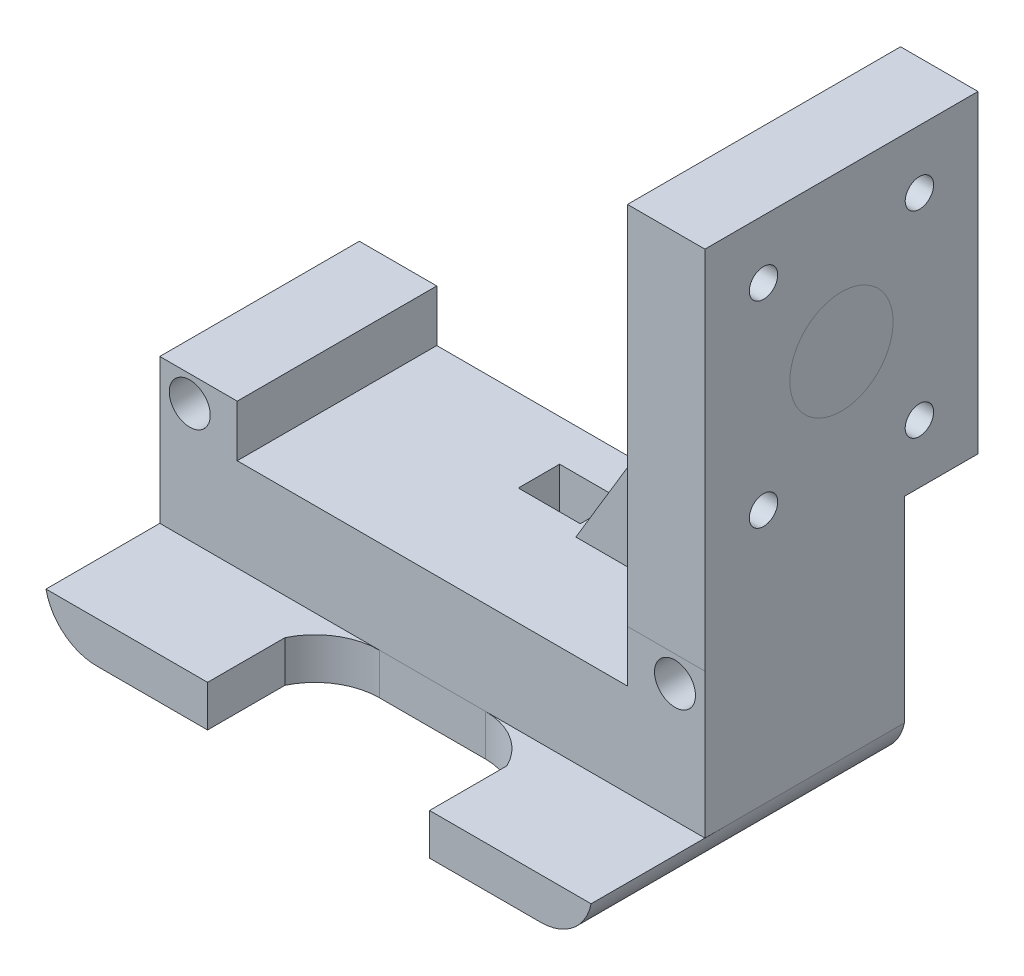
ISO-10303-21;
HEADER;
FILE_DESCRIPTION(('STEP AP214'),'2;1');
FILE_NAME('part.step','',(''),(''),'','','');
FILE_SCHEMA(('AUTOMOTIVE_DESIGN { 1 0 10303 214 1 1 1 1 }'));
ENDSEC;
DATA;
#1=APPLICATION_CONTEXT('core data for automotive mechanical design processes');
#2=APPLICATION_PROTOCOL_DEFINITION('international standard','automotive_design',2000,#1);
#3=PRODUCT_CONTEXT('',#1,'mechanical');
#4=PRODUCT('Part','Part','',(#3));
#5=PRODUCT_RELATED_PRODUCT_CATEGORY('part','',(#4));
#6=PRODUCT_DEFINITION_FORMATION('','',#4);
#7=PRODUCT_DEFINITION_CONTEXT('part definition',#1,'design');
#8=PRODUCT_DEFINITION('design','',#6,#7);
#9=PRODUCT_DEFINITION_SHAPE('','',#8);
#10=(LENGTH_UNIT() NAMED_UNIT(*) SI_UNIT(.MILLI.,.METRE.));
#11=(NAMED_UNIT(*) PLANE_ANGLE_UNIT() SI_UNIT($,.RADIAN.));
#12=(NAMED_UNIT(*) SI_UNIT($,.STERADIAN.) SOLID_ANGLE_UNIT());
#13=UNCERTAINTY_MEASURE_WITH_UNIT(LENGTH_MEASURE(1.E-05),#10,'distance_accuracy_value','');
#14=(GEOMETRIC_REPRESENTATION_CONTEXT(3) GLOBAL_UNCERTAINTY_ASSIGNED_CONTEXT((#13)) GLOBAL_UNIT_ASSIGNED_CONTEXT((#10,
#11,#12)) REPRESENTATION_CONTEXT('',''));
#15=CARTESIAN_POINT('',(0.,0.,0.));
#16=DIRECTION('',(0.,0.,1.));
#17=DIRECTION('',(1.,0.,0.));
#18=AXIS2_PLACEMENT_3D('',#15,#16,#17);
#19=CARTESIAN_POINT('',(52.7979589711327,18.,-35.7));
#20=DIRECTION('',(-1.,0.,0.));
#21=DIRECTION('',(0.,0.,1.));
#22=AXIS2_PLACEMENT_3D('',#19,#20,#21);
#23=PLANE('',#22);
#24=CARTESIAN_POINT('',(52.7979589711327,87.45,-48.5961117147642));
#25=DIRECTION('',(1.,0.,0.));
#26=DIRECTION('',(0.,0.,-1.));
#27=AXIS2_PLACEMENT_3D('',#24,#25,#26);
#28=CIRCLE('',#27,2.74999999999999);
#29=CARTESIAN_POINT('',(52.7979589711327,87.45,-51.3461117147642));
#30=VERTEX_POINT('',#29);
#31=EDGE_CURVE('E559',#30,#30,#28,.T.);
#32=ORIENTED_EDGE('',*,*,#31,.F.);
#33=EDGE_LOOP('',(#32));
#34=FACE_BOUND('',#33,.T.);
#35=CARTESIAN_POINT('',(52.7979589711327,87.45,-18.3961117147642));
#36=DIRECTION('',(1.,0.,0.));
#37=DIRECTION('',(0.,0.,-1.));
#38=AXIS2_PLACEMENT_3D('',#35,#36,#37);
#39=CIRCLE('',#38,2.74999999999999);
#40=CARTESIAN_POINT('',(52.7979589711327,87.45,-21.1461117147642));
#41=VERTEX_POINT('',#40);
#42=EDGE_CURVE('E498',#41,#41,#39,.T.);
#43=ORIENTED_EDGE('',*,*,#42,.F.);
#44=EDGE_LOOP('',(#43));
#45=FACE_BOUND('',#44,.T.);
#46=CARTESIAN_POINT('',(52.7979589711327,49.35,-18.3961117147642));
#47=DIRECTION('',(1.,0.,0.));
#48=DIRECTION('',(0.,0.,-1.));
#49=AXIS2_PLACEMENT_3D('',#46,#47,#48);
#50=CIRCLE('',#49,2.74999999999999);
#51=CARTESIAN_POINT('',(52.7979589711327,49.35,-21.1461117147642));
#52=VERTEX_POINT('',#51);
#53=EDGE_CURVE('E497',#52,#52,#50,.T.);
#54=ORIENTED_EDGE('',*,*,#53,.F.);
#55=EDGE_LOOP('',(#54));
#56=FACE_BOUND('',#55,.T.);
#57=DIRECTION('',(0.,-1.,0.));
#58=VECTOR('',#57,1.);
#59=CARTESIAN_POINT('',(52.7979589711327,18.,-45.7));
#60=LINE('',#59,#58);
#61=CARTESIAN_POINT('',(52.7979589711327,38.,-45.7));
#62=VERTEX_POINT('',#61);
#63=CARTESIAN_POINT('',(52.7979589711327,0.,-45.7));
#64=VERTEX_POINT('',#63);
#65=EDGE_CURVE('E248',#62,#64,#60,.T.);
#66=ORIENTED_EDGE('',*,*,#65,.F.);
#67=DIRECTION('',(0.,0.,1.));
#68=VECTOR('',#67,1.);
#69=CARTESIAN_POINT('',(52.7979589711327,38.,-59.9461117147642));
#70=LINE('',#69,#68);
#71=CARTESIAN_POINT('',(52.7979589711327,38.,-59.9461117147642));
#72=VERTEX_POINT('',#71);
#73=EDGE_CURVE('E232',#72,#62,#70,.T.);
#74=ORIENTED_EDGE('',*,*,#73,.F.);
#75=DIRECTION('',(0.,1.,0.));
#76=VECTOR('',#75,1.);
#77=CARTESIAN_POINT('',(52.7979589711327,28.,-59.9461117147642));
#78=LINE('',#77,#76);
#79=CARTESIAN_POINT('',(52.7979589711327,98.8,-59.9461117147642));
#80=VERTEX_POINT('',#79);
#81=EDGE_CURVE('E245',#72,#80,#78,.T.);
#82=ORIENTED_EDGE('',*,*,#81,.T.);
#83=DIRECTION('',(0.,0.,1.));
#84=VECTOR('',#83,1.);
#85=CARTESIAN_POINT('',(52.7979589711327,98.8,-7.04611171476423));
#86=LINE('',#85,#84);
#87=CARTESIAN_POINT('',(52.7979589711327,98.8,-7.04611171476423));
#88=VERTEX_POINT('',#87);
#89=EDGE_CURVE('E257',#80,#88,#86,.T.);
#90=ORIENTED_EDGE('',*,*,#89,.T.);
#91=DIRECTION('',(0.,-1.,0.));
#92=VECTOR('',#91,1.);
#93=CARTESIAN_POINT('',(52.7979589711327,18.,-7.04611171476423));
#94=LINE('',#93,#92);
#95=CARTESIAN_POINT('',(52.7979589711327,28.,-7.04611171476423));
#96=VERTEX_POINT('',#95);
#97=EDGE_CURVE('E398',#88,#96,#94,.T.);
#98=ORIENTED_EDGE('',*,*,#97,.T.);
#99=CARTESIAN_POINT('',(52.7979589711327,0.,-7.04611171476423));
#100=VERTEX_POINT('',#99);
#101=EDGE_CURVE('E390',#96,#100,#94,.T.);
#102=ORIENTED_EDGE('',*,*,#101,.T.);
#103=DIRECTION('',(0.,0.,-1.));
#104=VECTOR('',#103,1.);
#105=CARTESIAN_POINT('',(52.7979589711327,0.,-35.7));
#106=LINE('',#105,#104);
#107=EDGE_CURVE('E391',#100,#64,#106,.T.);
#108=ORIENTED_EDGE('',*,*,#107,.T.);
#109=EDGE_LOOP('',(#66,#74,#82,#90,#98,#102,#108));
#110=FACE_BOUND('',#109,.T.);
#111=CARTESIAN_POINT('',(52.7979589711327,49.35,-48.5961117147642));
#112=DIRECTION('',(1.,0.,0.));
#113=DIRECTION('',(0.,0.,-1.));
#114=AXIS2_PLACEMENT_3D('',#111,#112,#113);
#115=CIRCLE('',#114,2.74999999999999);
#116=CARTESIAN_POINT('',(52.7979589711327,49.35,-51.3461117147642));
#117=VERTEX_POINT('',#116);
#118=EDGE_CURVE('E264',#117,#117,#115,.T.);
#119=ORIENTED_EDGE('',*,*,#118,.F.);
#120=EDGE_LOOP('',(#119));
#121=FACE_BOUND('',#120,.T.);
#122=CARTESIAN_POINT('',(52.7979589711327,68.4,-33.4961117147642));
#123=DIRECTION('',(-1.,0.,0.));
#124=DIRECTION('',(0.,0.,1.));
#125=AXIS2_PLACEMENT_3D('',#122,#123,#124);
#126=CIRCLE('',#125,10.);
#127=CARTESIAN_POINT('',(52.7979589711327,68.4,-23.4961117147642));
#128=VERTEX_POINT('',#127);
#129=EDGE_CURVE('E11',#128,#128,#126,.F.);
#130=ORIENTED_EDGE('',*,*,#129,.F.);
#131=EDGE_LOOP('',(#130));
#132=FACE_BOUND('',#131,.T.);
#133=ADVANCED_FACE('F50',(#34,#45,#56,#110,#121,#132),#23,.F.);
#134=CARTESIAN_POINT('',(-10.2525512860841,7.,-7.04611171476423));
#135=DIRECTION('',(0.,0.,-1.));
#136=DIRECTION('',(-1.,0.,0.));
#137=AXIS2_PLACEMENT_3D('',#134,#135,#136);
#138=PLANE('',#137);
#139=DIRECTION('',(1.,0.,0.));
#140=VECTOR('',#139,1.);
#141=CARTESIAN_POINT('',(-10.2525512860841,0.,-7.04611171476423));
#142=LINE('',#141,#140);
#143=CARTESIAN_POINT('',(-10.2525512860841,0.,-7.04611171476423));
#144=VERTEX_POINT('',#143);
#145=CARTESIAN_POINT('',(10.2525512860841,0.,-7.04611171476423));
#146=VERTEX_POINT('',#145);
#147=EDGE_CURVE('E59',#144,#146,#142,.T.);
#148=ORIENTED_EDGE('',*,*,#147,.F.);
#149=DIRECTION('',(0.,-1.,0.));
#150=VECTOR('',#149,1.);
#151=CARTESIAN_POINT('',(-10.2525512860841,7.,-7.04611171476423));
#152=LINE('',#151,#150);
#153=CARTESIAN_POINT('',(-10.2525512860841,-8.,-7.04611171476423));
#154=VERTEX_POINT('',#153);
#155=EDGE_CURVE('E449',#144,#154,#152,.T.);
#156=ORIENTED_EDGE('',*,*,#155,.T.);
#157=DIRECTION('',(1.,0.,0.));
#158=VECTOR('',#157,1.);
#159=CARTESIAN_POINT('',(-10.2525512860841,-8.,-7.04611171476423));
#160=LINE('',#159,#158);
#161=CARTESIAN_POINT('',(10.2525512860841,-8.,-7.04611171476423));
#162=VERTEX_POINT('',#161);
#163=EDGE_CURVE('E423',#154,#162,#160,.T.);
#164=ORIENTED_EDGE('',*,*,#163,.T.);
#165=DIRECTION('',(0.,-1.,0.));
#166=VECTOR('',#165,1.);
#167=CARTESIAN_POINT('',(10.2525512860841,7.,-7.04611171476423));
#168=LINE('',#167,#166);
#169=EDGE_CURVE('E446',#146,#162,#168,.T.);
#170=ORIENTED_EDGE('',*,*,#169,.F.);
#171=EDGE_LOOP('',(#148,#156,#164,#170));
#172=FACE_BOUND('',#171,.T.);
#173=ADVANCED_FACE('F517',(#172),#138,.F.);
#174=DIRECTION('',(-1.,0.,0.));
#175=VECTOR('',#174,1.);
#176=CARTESIAN_POINT('',(-10.2525512860841,28.,-7.04611171476423));
#177=LINE('',#176,#175);
#178=CARTESIAN_POINT('',(37.7979589711327,28.,-7.04611171476423));
#179=VERTEX_POINT('',#178);
#180=EDGE_CURVE('E66',#96,#179,#177,.T.);
#181=ORIENTED_EDGE('',*,*,#180,.F.);
#182=ORIENTED_EDGE('',*,*,#97,.F.);
#183=DIRECTION('',(1.,0.,0.));
#184=VECTOR('',#183,1.);
#185=CARTESIAN_POINT('',(-50.5821858578955,98.8,-7.04611171476423));
#186=LINE('',#185,#184);
#187=CARTESIAN_POINT('',(37.7979589711327,98.8,-7.04611171476423));
#188=VERTEX_POINT('',#187);
#189=EDGE_CURVE('E270',#188,#88,#186,.T.);
#190=ORIENTED_EDGE('',*,*,#189,.F.);
#191=DIRECTION('',(0.,-1.,0.));
#192=VECTOR('',#191,1.);
#193=CARTESIAN_POINT('',(37.7979589711327,28.,-7.04611171476423));
#194=LINE('',#193,#192);
#195=EDGE_CURVE('E294',#188,#179,#194,.T.);
#196=ORIENTED_EDGE('',*,*,#195,.T.);
#197=EDGE_LOOP('',(#181,#182,#190,#196));
#198=FACE_BOUND('',#197,.T.);
#199=ADVANCED_FACE('F629',(#198),#138,.F.);
#200=CARTESIAN_POINT('',(37.7979589711327,68.,-104.009518948453));
#201=DIRECTION('',(-0.857492925712544,0.514495755427526,0.));
#202=DIRECTION('',(-0.514495755427526,-0.857492925712544,0.));
#203=AXIS2_PLACEMENT_3D('',#200,#201,#202);
#204=PLANE('',#203);
#205=DIRECTION('',(0.,0.,1.));
#206=VECTOR('',#205,1.);
#207=CARTESIAN_POINT('',(37.7979589711327,68.,-104.009518948453));
#208=LINE('',#207,#206);
#209=CARTESIAN_POINT('',(37.7979589711327,68.,-43.7));
#210=VERTEX_POINT('',#209);
#211=CARTESIAN_POINT('',(37.7979589711327,68.,-27.0461117147642));
#212=VERTEX_POINT('',#211);
#213=EDGE_CURVE('E547',#210,#212,#208,.T.);
#214=ORIENTED_EDGE('',*,*,#213,.F.);
#215=DIRECTION('',(0.514495755427526,0.857492925712544,0.));
#216=VECTOR('',#215,1.);
#217=CARTESIAN_POINT('',(37.7979589711327,68.,-43.7));
#218=LINE('',#217,#216);
#219=CARTESIAN_POINT('',(7.7979589711327,18.,-43.7));
#220=VERTEX_POINT('',#219);
#221=EDGE_CURVE('E587',#220,#210,#218,.T.);
#222=ORIENTED_EDGE('',*,*,#221,.F.);
#223=DIRECTION('',(0.,0.,1.));
#224=VECTOR('',#223,1.);
#225=CARTESIAN_POINT('',(7.7979589711327,18.,-104.009518948453));
#226=LINE('',#225,#224);
#227=CARTESIAN_POINT('',(7.7979589711327,18.,-27.0461117147642));
#228=VERTEX_POINT('',#227);
#229=EDGE_CURVE('E563',#220,#228,#226,.T.);
#230=ORIENTED_EDGE('',*,*,#229,.T.);
#231=DIRECTION('',(-0.514495755427526,-0.857492925712544,0.));
#232=VECTOR('',#231,1.);
#233=CARTESIAN_POINT('',(37.7979589711327,68.,-27.0461117147642));
#234=LINE('',#233,#232);
#235=EDGE_CURVE('E575',#212,#228,#234,.T.);
#236=ORIENTED_EDGE('',*,*,#235,.F.);
#237=EDGE_LOOP('',(#214,#222,#230,#236));
#238=FACE_BOUND('',#237,.T.);
#239=ADVANCED_FACE('F626',(#238),#204,.T.);
#240=ORIENTED_EDGE('',*,*,#129,.T.);
#241=EDGE_LOOP('',(#240));
#242=FACE_BOUND('',#241,.T.);
#243=ADVANCED_FACE('F628',(#242),#23,.F.);
#244=CARTESIAN_POINT('',(0.,18.,0.));
#245=DIRECTION('',(0.,1.,0.));
#246=DIRECTION('',(0.,0.,1.));
#247=AXIS2_PLACEMENT_3D('',#244,#245,#246);
#248=PLANE('',#247);
#249=ORIENTED_EDGE('',*,*,#229,.F.);
#250=DIRECTION('',(-1.,0.,0.));
#251=VECTOR('',#250,1.);
#252=CARTESIAN_POINT('',(7.7979589711327,18.,-43.7));
#253=LINE('',#252,#251);
#254=CARTESIAN_POINT('',(37.7979589711327,18.,-43.7));
#255=VERTEX_POINT('',#254);
#256=EDGE_CURVE('E596',#255,#220,#253,.T.);
#257=ORIENTED_EDGE('',*,*,#256,.F.);
#258=DIRECTION('',(0.,0.,-1.));
#259=VECTOR('',#258,1.);
#260=CARTESIAN_POINT('',(37.7979589711327,18.,-43.7));
#261=LINE('',#260,#259);
#262=CARTESIAN_POINT('',(37.7979589711327,18.,-45.7));
#263=VERTEX_POINT('',#262);
#264=EDGE_CURVE('E583',#255,#263,#261,.T.);
#265=ORIENTED_EDGE('',*,*,#264,.T.);
#266=DIRECTION('',(1.,0.,0.));
#267=VECTOR('',#266,1.);
#268=CARTESIAN_POINT('',(-52.7979589711327,18.,-45.7));
#269=LINE('',#268,#267);
#270=CARTESIAN_POINT('',(-37.7979589711327,18.,-45.7));
#271=VERTEX_POINT('',#270);
#272=EDGE_CURVE('E342',#271,#263,#269,.T.);
#273=ORIENTED_EDGE('',*,*,#272,.F.);
#274=DIRECTION('',(0.,0.,-1.));
#275=VECTOR('',#274,1.);
#276=CARTESIAN_POINT('',(-37.7979589711327,18.,-45.7));
#277=LINE('',#276,#275);
#278=CARTESIAN_POINT('',(-37.7979589711327,18.,-7.04611171476423));
#279=VERTEX_POINT('',#278);
#280=EDGE_CURVE('E297',#279,#271,#277,.T.);
#281=ORIENTED_EDGE('',*,*,#280,.F.);
#282=DIRECTION('',(1.,0.,0.));
#283=VECTOR('',#282,1.);
#284=CARTESIAN_POINT('',(-52.7979589711327,18.,-7.04611171476423));
#285=LINE('',#284,#283);
#286=CARTESIAN_POINT('',(37.7979589711327,18.,-7.04611171476423));
#287=VERTEX_POINT('',#286);
#288=EDGE_CURVE('E386',#279,#287,#285,.T.);
#289=ORIENTED_EDGE('',*,*,#288,.T.);
#290=DIRECTION('',(0.,0.,1.));
#291=VECTOR('',#290,1.);
#292=CARTESIAN_POINT('',(37.7979589711327,18.,-27.0461117147642));
#293=LINE('',#292,#291);
#294=CARTESIAN_POINT('',(37.7979589711327,18.,-27.0461117147642));
#295=VERTEX_POINT('',#294);
#296=EDGE_CURVE('E548',#295,#287,#293,.T.);
#297=ORIENTED_EDGE('',*,*,#296,.F.);
#298=DIRECTION('',(1.,0.,0.));
#299=VECTOR('',#298,1.);
#300=CARTESIAN_POINT('',(7.7979589711327,18.,-27.0461117147642));
#301=LINE('',#300,#299);
#302=EDGE_CURVE('E571',#228,#295,#301,.T.);
#303=ORIENTED_EDGE('',*,*,#302,.F.);
#304=EDGE_LOOP('',(#249,#257,#265,#273,#281,#289,#297,#303));
#305=FACE_BOUND('',#304,.T.);
#306=DIRECTION('',(0.,0.,1.));
#307=VECTOR('',#306,1.);
#308=CARTESIAN_POINT('',(-6.00000000000001,18.,-35.7));
#309=LINE('',#308,#307);
#310=CARTESIAN_POINT('',(-6.00000000000001,18.,-37.7));
#311=VERTEX_POINT('',#310);
#312=CARTESIAN_POINT('',(-6.,18.,-29.7));
#313=VERTEX_POINT('',#312);
#314=EDGE_CURVE('E356',#311,#313,#309,.T.);
#315=ORIENTED_EDGE('',*,*,#314,.F.);
#316=DIRECTION('',(1.,0.,0.));
#317=VECTOR('',#316,1.);
#318=CARTESIAN_POINT('',(0.,18.,-37.7));
#319=LINE('',#318,#317);
#320=CARTESIAN_POINT('',(5.99999999999999,18.,-37.7));
#321=VERTEX_POINT('',#320);
#322=EDGE_CURVE('E323',#311,#321,#319,.T.);
#323=ORIENTED_EDGE('',*,*,#322,.T.);
#324=DIRECTION('',(0.,0.,-1.));
#325=VECTOR('',#324,1.);
#326=CARTESIAN_POINT('',(5.99999999999999,18.,-35.7));
#327=LINE('',#326,#325);
#328=CARTESIAN_POINT('',(5.99999999999999,18.,-29.7));
#329=VERTEX_POINT('',#328);
#330=EDGE_CURVE('E361',#329,#321,#327,.T.);
#331=ORIENTED_EDGE('',*,*,#330,.F.);
#332=DIRECTION('',(1.,0.,0.));
#333=VECTOR('',#332,1.);
#334=CARTESIAN_POINT('',(-6.,18.,-29.7));
#335=LINE('',#334,#333);
#336=EDGE_CURVE('E372',#313,#329,#335,.T.);
#337=ORIENTED_EDGE('',*,*,#336,.F.);
#338=EDGE_LOOP('',(#315,#323,#331,#337));
#339=FACE_BOUND('',#338,.T.);
#340=ADVANCED_FACE('F614',(#305,#339),#248,.T.);
#341=CARTESIAN_POINT('',(-6.00000000000001,-8.,-35.7));
#342=DIRECTION('',(-1.,0.,0.));
#343=DIRECTION('',(0.,0.,1.));
#344=AXIS2_PLACEMENT_3D('',#341,#342,#343);
#345=PLANE('',#344);
#346=DIRECTION('',(0.,-1.,0.));
#347=VECTOR('',#346,1.);
#348=CARTESIAN_POINT('',(-6.00000000000001,32.422205101856,-37.7));
#349=LINE('',#348,#347);
#350=CARTESIAN_POINT('',(-6.00000000000001,-8.,-37.7));
#351=VERTEX_POINT('',#350);
#352=EDGE_CURVE('E328',#311,#351,#349,.T.);
#353=ORIENTED_EDGE('',*,*,#352,.F.);
#354=ORIENTED_EDGE('',*,*,#314,.T.);
#355=DIRECTION('',(0.,1.,0.));
#356=VECTOR('',#355,1.);
#357=CARTESIAN_POINT('',(-6.,-8.,-29.7));
#358=LINE('',#357,#356);
#359=CARTESIAN_POINT('',(-6.,-8.,-29.7));
#360=VERTEX_POINT('',#359);
#361=EDGE_CURVE('E369',#360,#313,#358,.T.);
#362=ORIENTED_EDGE('',*,*,#361,.F.);
#363=DIRECTION('',(0.,0.,1.));
#364=VECTOR('',#363,1.);
#365=CARTESIAN_POINT('',(-6.00000000000001,-8.,-35.7));
#366=LINE('',#365,#364);
#367=EDGE_CURVE('E357',#351,#360,#366,.T.);
#368=ORIENTED_EDGE('',*,*,#367,.F.);
#369=EDGE_LOOP('',(#353,#354,#362,#368));
#370=FACE_BOUND('',#369,.T.);
#371=ADVANCED_FACE('F737',(#370),#345,.F.);
#372=CARTESIAN_POINT('',(5.99999999999999,-8.,-35.7));
#373=DIRECTION('',(1.,0.,0.));
#374=DIRECTION('',(0.,0.,-1.));
#375=AXIS2_PLACEMENT_3D('',#372,#373,#374);
#376=PLANE('',#375);
#377=DIRECTION('',(0.,-1.,0.));
#378=VECTOR('',#377,1.);
#379=CARTESIAN_POINT('',(5.99999999999999,32.422205101856,-37.7));
#380=LINE('',#379,#378);
#381=CARTESIAN_POINT('',(5.99999999999999,-8.,-37.7));
#382=VERTEX_POINT('',#381);
#383=EDGE_CURVE('E331',#321,#382,#380,.T.);
#384=ORIENTED_EDGE('',*,*,#383,.T.);
#385=DIRECTION('',(0.,0.,-1.));
#386=VECTOR('',#385,1.);
#387=CARTESIAN_POINT('',(5.99999999999999,-8.,-35.7));
#388=LINE('',#387,#386);
#389=CARTESIAN_POINT('',(5.99999999999999,-8.,-29.7));
#390=VERTEX_POINT('',#389);
#391=EDGE_CURVE('E365',#390,#382,#388,.T.);
#392=ORIENTED_EDGE('',*,*,#391,.F.);
#393=DIRECTION('',(0.,1.,0.));
#394=VECTOR('',#393,1.);
#395=CARTESIAN_POINT('',(5.99999999999999,-8.,-29.7));
#396=LINE('',#395,#394);
#397=EDGE_CURVE('E379',#390,#329,#396,.T.);
#398=ORIENTED_EDGE('',*,*,#397,.T.);
#399=ORIENTED_EDGE('',*,*,#330,.T.);
#400=EDGE_LOOP('',(#384,#392,#398,#399));
#401=FACE_BOUND('',#400,.T.);
#402=ADVANCED_FACE('F675',(#401),#376,.F.);
#403=CARTESIAN_POINT('',(0.,0.,0.));
#404=DIRECTION('',(0.,-1.,0.));
#405=DIRECTION('',(0.,0.,-1.));
#406=AXIS2_PLACEMENT_3D('',#403,#404,#405);
#407=PLANE('',#406);
#408=DIRECTION('',(1.,0.,0.));
#409=VECTOR('',#408,1.);
#410=CARTESIAN_POINT('',(-52.7979589711327,0.,-7.04611171476423));
#411=LINE('',#410,#409);
#412=CARTESIAN_POINT('',(-52.7979589711327,0.,-7.04611171476423));
#413=VERTEX_POINT('',#412);
#414=EDGE_CURVE('E382',#413,#144,#411,.T.);
#415=ORIENTED_EDGE('',*,*,#414,.F.);
#416=DIRECTION('',(0.,0.,-1.));
#417=VECTOR('',#416,1.);
#418=CARTESIAN_POINT('',(-52.7979589711327,0.,15.));
#419=LINE('',#418,#417);
#420=CARTESIAN_POINT('',(-52.7979589711327,0.,15.));
#421=VERTEX_POINT('',#420);
#422=EDGE_CURVE('E406',#413,#421,#419,.F.);
#423=ORIENTED_EDGE('',*,*,#422,.T.);
#424=DIRECTION('',(1.,0.,0.));
#425=VECTOR('',#424,1.);
#426=CARTESIAN_POINT('',(-45.,0.,15.));
#427=LINE('',#426,#425);
#428=CARTESIAN_POINT('',(-21.5,0.,15.));
#429=VERTEX_POINT('',#428);
#430=EDGE_CURVE('E454',#421,#429,#427,.T.);
#431=ORIENTED_EDGE('',*,*,#430,.T.);
#432=DIRECTION('',(0.,0.,-1.));
#433=VECTOR('',#432,1.);
#434=CARTESIAN_POINT('',(-21.5,0.,0.));
#435=LINE('',#434,#433);
#436=CARTESIAN_POINT('',(-21.5,0.,0.));
#437=VERTEX_POINT('',#436);
#438=EDGE_CURVE('E489',#429,#437,#435,.T.);
#439=ORIENTED_EDGE('',*,*,#438,.T.);
#440=CARTESIAN_POINT('',(-10.2525512860841,0.,5.45388828523577));
#441=DIRECTION('',(0.,-1.,0.));
#442=DIRECTION('',(0.,0.,-1.));
#443=AXIS2_PLACEMENT_3D('',#440,#441,#442);
#444=CIRCLE('',#443,12.5);
#445=EDGE_CURVE('E477',#437,#144,#444,.T.);
#446=ORIENTED_EDGE('',*,*,#445,.T.);
#447=EDGE_LOOP('',(#415,#423,#431,#439,#446));
#448=FACE_BOUND('',#447,.T.);
#449=ADVANCED_FACE('F672',(#448),#407,.F.);
#450=EDGE_CURVE('E395',#146,#100,#411,.T.);
#451=ORIENTED_EDGE('',*,*,#450,.F.);
#452=CARTESIAN_POINT('',(10.2525512860841,0.,5.45388828523578));
#453=DIRECTION('',(0.,-1.,0.));
#454=DIRECTION('',(0.,0.,-1.));
#455=AXIS2_PLACEMENT_3D('',#452,#453,#454);
#456=CIRCLE('',#455,12.5);
#457=CARTESIAN_POINT('',(21.5,0.,0.));
#458=VERTEX_POINT('',#457);
#459=EDGE_CURVE('E481',#146,#458,#456,.T.);
#460=ORIENTED_EDGE('',*,*,#459,.T.);
#461=DIRECTION('',(0.,0.,1.));
#462=VECTOR('',#461,1.);
#463=CARTESIAN_POINT('',(21.5,0.,0.));
#464=LINE('',#463,#462);
#465=CARTESIAN_POINT('',(21.5,0.,15.));
#466=VERTEX_POINT('',#465);
#467=EDGE_CURVE('E485',#458,#466,#464,.T.);
#468=ORIENTED_EDGE('',*,*,#467,.T.);
#469=CARTESIAN_POINT('',(52.7979589711327,0.,15.));
#470=VERTEX_POINT('',#469);
#471=EDGE_CURVE('E438',#466,#470,#427,.T.);
#472=ORIENTED_EDGE('',*,*,#471,.T.);
#473=DIRECTION('',(0.,0.,1.));
#474=VECTOR('',#473,1.);
#475=CARTESIAN_POINT('',(52.7979589711327,0.,15.));
#476=LINE('',#475,#474);
#477=EDGE_CURVE('E411',#470,#100,#476,.F.);
#478=ORIENTED_EDGE('',*,*,#477,.T.);
#479=EDGE_LOOP('',(#451,#460,#468,#472,#478));
#480=FACE_BOUND('',#479,.T.);
#481=ADVANCED_FACE('F510',(#480),#407,.F.);
#482=CARTESIAN_POINT('',(-45.,184.15,15.));
#483=DIRECTION('',(0.,0.,-1.));
#484=DIRECTION('',(-1.,0.,0.));
#485=AXIS2_PLACEMENT_3D('',#482,#483,#484);
#486=PLANE('',#485);
#487=CARTESIAN_POINT('',(43.,2.,15.));
#488=DIRECTION('',(0.,0.,-1.));
#489=DIRECTION('',(-1.,0.,0.));
#490=AXIS2_PLACEMENT_3D('',#487,#488,#489);
#491=CIRCLE('',#490,10.);
#492=CARTESIAN_POINT('',(43.,-8.,15.));
#493=VERTEX_POINT('',#492);
#494=EDGE_CURVE('E466',#493,#470,#491,.F.);
#495=ORIENTED_EDGE('',*,*,#494,.T.);
#496=ORIENTED_EDGE('',*,*,#471,.F.);
#497=DIRECTION('',(0.,-1.,0.));
#498=VECTOR('',#497,1.);
#499=CARTESIAN_POINT('',(21.5,7.,15.));
#500=LINE('',#499,#498);
#501=CARTESIAN_POINT('',(21.5,-8.,15.));
#502=VERTEX_POINT('',#501);
#503=EDGE_CURVE('E439',#466,#502,#500,.T.);
#504=ORIENTED_EDGE('',*,*,#503,.T.);
#505=DIRECTION('',(1.,0.,0.));
#506=VECTOR('',#505,1.);
#507=CARTESIAN_POINT('',(0.,-8.,15.));
#508=LINE('',#507,#506);
#509=EDGE_CURVE('E458',#502,#493,#508,.T.);
#510=ORIENTED_EDGE('',*,*,#509,.T.);
#511=EDGE_LOOP('',(#495,#496,#504,#510));
#512=FACE_BOUND('',#511,.T.);
#513=ADVANCED_FACE('F529',(#512),#486,.F.);
#514=ORIENTED_EDGE('',*,*,#430,.F.);
#515=CARTESIAN_POINT('',(-43.,2.,15.));
#516=DIRECTION('',(0.,0.,-1.));
#517=DIRECTION('',(-1.,0.,0.));
#518=AXIS2_PLACEMENT_3D('',#515,#516,#517);
#519=CIRCLE('',#518,10.);
#520=CARTESIAN_POINT('',(-43.,-8.,15.));
#521=VERTEX_POINT('',#520);
#522=EDGE_CURVE('E463',#421,#521,#519,.F.);
#523=ORIENTED_EDGE('',*,*,#522,.T.);
#524=CARTESIAN_POINT('',(-21.5,-8.,15.));
#525=VERTEX_POINT('',#524);
#526=EDGE_CURVE('E459',#521,#525,#508,.T.);
#527=ORIENTED_EDGE('',*,*,#526,.T.);
#528=DIRECTION('',(0.,-1.,0.));
#529=VECTOR('',#528,1.);
#530=CARTESIAN_POINT('',(-21.5,7.,15.));
#531=LINE('',#530,#529);
#532=EDGE_CURVE('E435',#429,#525,#531,.T.);
#533=ORIENTED_EDGE('',*,*,#532,.F.);
#534=EDGE_LOOP('',(#514,#523,#527,#533));
#535=FACE_BOUND('',#534,.T.);
#536=ADVANCED_FACE('F677',(#535),#486,.F.);
#537=CARTESIAN_POINT('',(0.,-8.,0.));
#538=DIRECTION('',(0.,-1.,0.));
#539=DIRECTION('',(0.,0.,-1.));
#540=AXIS2_PLACEMENT_3D('',#537,#538,#539);
#541=PLANE('',#540);
#542=DIRECTION('',(1.,0.,0.));
#543=VECTOR('',#542,1.);
#544=CARTESIAN_POINT('',(0.,-8.,-37.7));
#545=LINE('',#544,#543);
#546=EDGE_CURVE('E324',#351,#382,#545,.T.);
#547=ORIENTED_EDGE('',*,*,#546,.F.);
#548=ORIENTED_EDGE('',*,*,#367,.T.);
#549=DIRECTION('',(1.,0.,0.));
#550=VECTOR('',#549,1.);
#551=CARTESIAN_POINT('',(-6.,-8.,-29.7));
#552=LINE('',#551,#550);
#553=EDGE_CURVE('E360',#360,#390,#552,.T.);
#554=ORIENTED_EDGE('',*,*,#553,.T.);
#555=ORIENTED_EDGE('',*,*,#391,.T.);
#556=EDGE_LOOP('',(#547,#548,#554,#555));
#557=FACE_BOUND('',#556,.T.);
#558=DIRECTION('',(-1.,0.,0.));
#559=VECTOR('',#558,1.);
#560=CARTESIAN_POINT('',(-6.00000000000001,-8.,-45.7));
#561=LINE('',#560,#559);
#562=CARTESIAN_POINT('',(43.,-8.,-45.7));
#563=VERTEX_POINT('',#562);
#564=CARTESIAN_POINT('',(-43.,-8.,-45.7));
#565=VERTEX_POINT('',#564);
#566=EDGE_CURVE('E345',#563,#565,#561,.T.);
#567=ORIENTED_EDGE('',*,*,#566,.F.);
#568=DIRECTION('',(0.,0.,-1.));
#569=VECTOR('',#568,1.);
#570=CARTESIAN_POINT('',(43.,-8.,15.));
#571=LINE('',#570,#569);
#572=EDGE_CURVE('E473',#563,#493,#571,.F.);
#573=ORIENTED_EDGE('',*,*,#572,.T.);
#574=ORIENTED_EDGE('',*,*,#509,.F.);
#575=DIRECTION('',(0.,0.,1.));
#576=VECTOR('',#575,1.);
#577=CARTESIAN_POINT('',(21.5,-8.,0.));
#578=LINE('',#577,#576);
#579=CARTESIAN_POINT('',(21.5,-8.,0.));
#580=VERTEX_POINT('',#579);
#581=EDGE_CURVE('E431',#580,#502,#578,.T.);
#582=ORIENTED_EDGE('',*,*,#581,.F.);
#583=CARTESIAN_POINT('',(10.2525512860841,-8.,5.45388828523578));
#584=DIRECTION('',(0.,-1.,0.));
#585=DIRECTION('',(0.,0.,-1.));
#586=AXIS2_PLACEMENT_3D('',#583,#584,#585);
#587=CIRCLE('',#586,12.5);
#588=EDGE_CURVE('E427',#162,#580,#587,.T.);
#589=ORIENTED_EDGE('',*,*,#588,.F.);
#590=ORIENTED_EDGE('',*,*,#163,.F.);
#591=CARTESIAN_POINT('',(-10.2525512860841,-8.,5.45388828523577));
#592=DIRECTION('',(0.,-1.,0.));
#593=DIRECTION('',(0.,0.,1.));
#594=AXIS2_PLACEMENT_3D('',#591,#592,#593);
#595=CIRCLE('',#594,12.5);
#596=CARTESIAN_POINT('',(-21.5,-8.,0.));
#597=VERTEX_POINT('',#596);
#598=EDGE_CURVE('E419',#597,#154,#595,.T.);
#599=ORIENTED_EDGE('',*,*,#598,.F.);
#600=DIRECTION('',(0.,0.,-1.));
#601=VECTOR('',#600,1.);
#602=CARTESIAN_POINT('',(-21.5,-8.,0.));
#603=LINE('',#602,#601);
#604=EDGE_CURVE('E415',#525,#597,#603,.T.);
#605=ORIENTED_EDGE('',*,*,#604,.F.);
#606=ORIENTED_EDGE('',*,*,#526,.F.);
#607=DIRECTION('',(0.,0.,1.));
#608=VECTOR('',#607,1.);
#609=CARTESIAN_POINT('',(-43.,-8.,-23.));
#610=LINE('',#609,#608);
#611=EDGE_CURVE('E470',#521,#565,#610,.F.);
#612=ORIENTED_EDGE('',*,*,#611,.T.);
#613=EDGE_LOOP('',(#567,#573,#574,#582,#589,#590,#599,#605,#606,#612));
#614=FACE_BOUND('',#613,.T.);
#615=ADVANCED_FACE('F523',(#557,#614),#541,.T.);
#616=CARTESIAN_POINT('',(43.,2.,15.));
#617=DIRECTION('',(0.,0.,1.));
#618=DIRECTION('',(1.,0.,0.));
#619=AXIS2_PLACEMENT_3D('',#616,#617,#618);
#620=CYLINDRICAL_SURFACE('',#619,10.);
#621=ORIENTED_EDGE('',*,*,#477,.F.);
#622=ORIENTED_EDGE('',*,*,#494,.F.);
#623=ORIENTED_EDGE('',*,*,#572,.F.);
#624=CARTESIAN_POINT('',(43.,1.99999999999999,-45.7));
#625=DIRECTION('',(0.,0.,-1.));
#626=DIRECTION('',(-1.,0.,0.));
#627=AXIS2_PLACEMENT_3D('',#624,#625,#626);
#628=CIRCLE('',#627,9.99999999999999);
#629=EDGE_CURVE('E327',#64,#563,#628,.T.);
#630=ORIENTED_EDGE('',*,*,#629,.F.);
#631=ORIENTED_EDGE('',*,*,#107,.F.);
#632=EDGE_LOOP('',(#621,#622,#623,#630,#631));
#633=FACE_BOUND('',#632,.T.);
#634=ADVANCED_FACE('F682',(#633),#620,.T.);
#635=CARTESIAN_POINT('',(-43.,2.,15.));
#636=DIRECTION('',(0.,0.,-1.));
#637=DIRECTION('',(-1.,0.,0.));
#638=AXIS2_PLACEMENT_3D('',#635,#636,#637);
#639=CYLINDRICAL_SURFACE('',#638,10.);
#640=CARTESIAN_POINT('',(-52.7979589711327,0.,-45.7));
#641=VERTEX_POINT('',#640);
#642=EDGE_CURVE('E407',#641,#413,#419,.F.);
#643=ORIENTED_EDGE('',*,*,#642,.F.);
#644=CARTESIAN_POINT('',(-43.,1.99999999999999,-45.7));
#645=DIRECTION('',(0.,0.,-1.));
#646=DIRECTION('',(-1.,0.,0.));
#647=AXIS2_PLACEMENT_3D('',#644,#645,#646);
#648=CIRCLE('',#647,9.99999999999999);
#649=EDGE_CURVE('E349',#565,#641,#648,.T.);
#650=ORIENTED_EDGE('',*,*,#649,.F.);
#651=ORIENTED_EDGE('',*,*,#611,.F.);
#652=ORIENTED_EDGE('',*,*,#522,.F.);
#653=ORIENTED_EDGE('',*,*,#422,.F.);
#654=EDGE_LOOP('',(#643,#650,#651,#652,#653));
#655=FACE_BOUND('',#654,.T.);
#656=ADVANCED_FACE('F52',(#655),#639,.T.);
#657=CARTESIAN_POINT('',(-21.5,7.,0.));
#658=DIRECTION('',(-1.,0.,0.));
#659=DIRECTION('',(0.,0.,1.));
#660=AXIS2_PLACEMENT_3D('',#657,#658,#659);
#661=PLANE('',#660);
#662=ORIENTED_EDGE('',*,*,#532,.T.);
#663=ORIENTED_EDGE('',*,*,#604,.T.);
#664=DIRECTION('',(0.,-1.,0.));
#665=VECTOR('',#664,1.);
#666=CARTESIAN_POINT('',(-21.5,7.,0.));
#667=LINE('',#666,#665);
#668=EDGE_CURVE('E434',#437,#597,#667,.T.);
#669=ORIENTED_EDGE('',*,*,#668,.F.);
#670=ORIENTED_EDGE('',*,*,#438,.F.);
#671=EDGE_LOOP('',(#662,#663,#669,#670));
#672=FACE_BOUND('',#671,.T.);
#673=ADVANCED_FACE('F661',(#672),#661,.F.);
#674=CARTESIAN_POINT('',(21.5,7.,0.));
#675=DIRECTION('',(1.,0.,0.));
#676=DIRECTION('',(0.,0.,-1.));
#677=AXIS2_PLACEMENT_3D('',#674,#675,#676);
#678=PLANE('',#677);
#679=DIRECTION('',(0.,-1.,0.));
#680=VECTOR('',#679,1.);
#681=CARTESIAN_POINT('',(21.5,7.,0.));
#682=LINE('',#681,#680);
#683=EDGE_CURVE('E443',#458,#580,#682,.T.);
#684=ORIENTED_EDGE('',*,*,#683,.T.);
#685=ORIENTED_EDGE('',*,*,#581,.T.);
#686=ORIENTED_EDGE('',*,*,#503,.F.);
#687=ORIENTED_EDGE('',*,*,#467,.F.);
#688=EDGE_LOOP('',(#684,#685,#686,#687));
#689=FACE_BOUND('',#688,.T.);
#690=ADVANCED_FACE('F526',(#689),#678,.F.);
#691=CARTESIAN_POINT('',(10.2525512860841,7.,5.45388828523578));
#692=DIRECTION('',(0.,-1.,0.));
#693=DIRECTION('',(0.,0.,-1.));
#694=AXIS2_PLACEMENT_3D('',#691,#692,#693);
#695=CYLINDRICAL_SURFACE('',#694,12.5);
#696=ORIENTED_EDGE('',*,*,#169,.T.);
#697=ORIENTED_EDGE('',*,*,#588,.T.);
#698=ORIENTED_EDGE('',*,*,#683,.F.);
#699=ORIENTED_EDGE('',*,*,#459,.F.);
#700=EDGE_LOOP('',(#696,#697,#698,#699));
#701=FACE_BOUND('',#700,.T.);
#702=ADVANCED_FACE('F516',(#701),#695,.F.);
#703=CARTESIAN_POINT('',(-47.,23.,-7.04611171476423));
#704=DIRECTION('',(0.,0.,1.));
#705=DIRECTION('',(1.,0.,0.));
#706=AXIS2_PLACEMENT_3D('',#703,#704,#705);
#707=CIRCLE('',#706,3.96874999999999);
#708=CARTESIAN_POINT('',(-43.03125,23.,-7.04611171476423));
#709=VERTEX_POINT('',#708);
#710=EDGE_CURVE('E277',#709,#709,#707,.T.);
#711=ORIENTED_EDGE('',*,*,#710,.F.);
#712=EDGE_LOOP('',(#711));
#713=FACE_BOUND('',#712,.T.);
#714=CARTESIAN_POINT('',(47.,23.,-7.04611171476423));
#715=DIRECTION('',(0.,0.,1.));
#716=DIRECTION('',(1.,0.,0.));
#717=AXIS2_PLACEMENT_3D('',#714,#715,#716);
#718=CIRCLE('',#717,3.96874999999999);
#719=CARTESIAN_POINT('',(50.96875,23.,-7.04611171476423));
#720=VERTEX_POINT('',#719);
#721=EDGE_CURVE('E285',#720,#720,#718,.T.);
#722=ORIENTED_EDGE('',*,*,#721,.F.);
#723=EDGE_LOOP('',(#722));
#724=FACE_BOUND('',#723,.T.);
#725=ORIENTED_EDGE('',*,*,#414,.T.);
#726=ORIENTED_EDGE('',*,*,#147,.T.);
#727=ORIENTED_EDGE('',*,*,#450,.T.);
#728=ORIENTED_EDGE('',*,*,#101,.F.);
#729=ORIENTED_EDGE('',*,*,#180,.T.);
#730=EDGE_CURVE('E293',#179,#287,#194,.T.);
#731=ORIENTED_EDGE('',*,*,#730,.T.);
#732=ORIENTED_EDGE('',*,*,#288,.F.);
#733=DIRECTION('',(0.,-1.,0.));
#734=VECTOR('',#733,1.);
#735=CARTESIAN_POINT('',(-37.7979589711327,28.,-7.04611171476423));
#736=LINE('',#735,#734);
#737=CARTESIAN_POINT('',(-37.7979589711327,28.,-7.04611171476423));
#738=VERTEX_POINT('',#737);
#739=EDGE_CURVE('E319',#738,#279,#736,.T.);
#740=ORIENTED_EDGE('',*,*,#739,.F.);
#741=DIRECTION('',(1.,0.,0.));
#742=VECTOR('',#741,1.);
#743=CARTESIAN_POINT('',(-52.7979589711327,28.,-7.04611171476423));
#744=LINE('',#743,#742);
#745=CARTESIAN_POINT('',(-52.7979589711327,28.,-7.04611171476423));
#746=VERTEX_POINT('',#745);
#747=EDGE_CURVE('E302',#746,#738,#744,.T.);
#748=ORIENTED_EDGE('',*,*,#747,.F.);
#749=DIRECTION('',(0.,-1.,0.));
#750=VECTOR('',#749,1.);
#751=CARTESIAN_POINT('',(-52.7979589711327,18.,-7.04611171476423));
#752=LINE('',#751,#750);
#753=EDGE_CURVE('E402',#746,#413,#752,.T.);
#754=ORIENTED_EDGE('',*,*,#753,.T.);
#755=EDGE_LOOP('',(#725,#726,#727,#728,#729,#731,#732,#740,#748,#754));
#756=FACE_BOUND('',#755,.T.);
#757=ADVANCED_FACE('F504',(#713,#724,#756),#138,.F.);
#758=CARTESIAN_POINT('',(-10.2525512860841,7.,5.45388828523577));
#759=DIRECTION('',(0.,-1.,0.));
#760=DIRECTION('',(0.,0.,-1.));
#761=AXIS2_PLACEMENT_3D('',#758,#759,#760);
#762=CYLINDRICAL_SURFACE('',#761,12.5);
#763=ORIENTED_EDGE('',*,*,#668,.T.);
#764=ORIENTED_EDGE('',*,*,#598,.T.);
#765=ORIENTED_EDGE('',*,*,#155,.F.);
#766=ORIENTED_EDGE('',*,*,#445,.F.);
#767=EDGE_LOOP('',(#763,#764,#765,#766));
#768=FACE_BOUND('',#767,.T.);
#769=ADVANCED_FACE('F657',(#768),#762,.F.);
#770=CARTESIAN_POINT('',(-52.7979589711327,18.,-35.7));
#771=DIRECTION('',(1.,0.,0.));
#772=DIRECTION('',(0.,0.,-1.));
#773=AXIS2_PLACEMENT_3D('',#770,#771,#772);
#774=PLANE('',#773);
#775=ORIENTED_EDGE('',*,*,#642,.T.);
#776=ORIENTED_EDGE('',*,*,#753,.F.);
#777=DIRECTION('',(0.,0.,1.));
#778=VECTOR('',#777,1.);
#779=CARTESIAN_POINT('',(-52.7979589711327,28.,-45.7));
#780=LINE('',#779,#778);
#781=CARTESIAN_POINT('',(-52.7979589711327,28.,-45.7));
#782=VERTEX_POINT('',#781);
#783=EDGE_CURVE('E298',#782,#746,#780,.T.);
#784=ORIENTED_EDGE('',*,*,#783,.F.);
#785=DIRECTION('',(0.,1.,0.));
#786=VECTOR('',#785,1.);
#787=CARTESIAN_POINT('',(-52.7979589711327,0.,-45.7));
#788=LINE('',#787,#786);
#789=EDGE_CURVE('E353',#641,#782,#788,.T.);
#790=ORIENTED_EDGE('',*,*,#789,.F.);
#791=EDGE_LOOP('',(#775,#776,#784,#790));
#792=FACE_BOUND('',#791,.T.);
#793=ADVANCED_FACE('F653',(#792),#774,.F.);
#794=CARTESIAN_POINT('',(-6.,-8.,-29.7));
#795=DIRECTION('',(0.,0.,1.));
#796=DIRECTION('',(1.,0.,0.));
#797=AXIS2_PLACEMENT_3D('',#794,#795,#796);
#798=PLANE('',#797);
#799=ORIENTED_EDGE('',*,*,#336,.T.);
#800=ORIENTED_EDGE('',*,*,#397,.F.);
#801=ORIENTED_EDGE('',*,*,#553,.F.);
#802=ORIENTED_EDGE('',*,*,#361,.T.);
#803=EDGE_LOOP('',(#799,#800,#801,#802));
#804=FACE_BOUND('',#803,.T.);
#805=ADVANCED_FACE('F656',(#804),#798,.F.);
#806=CARTESIAN_POINT('',(-43.,1.99999999999999,-45.7));
#807=DIRECTION('',(0.,0.,-1.));
#808=DIRECTION('',(-1.,0.,0.));
#809=AXIS2_PLACEMENT_3D('',#806,#807,#808);
#810=PLANE('',#809);
#811=DIRECTION('',(0.,-1.,0.));
#812=VECTOR('',#811,1.);
#813=CARTESIAN_POINT('',(37.7979589711327,18.,-45.7));
#814=LINE('',#813,#812);
#815=CARTESIAN_POINT('',(37.7979589711327,38.,-45.7));
#816=VERTEX_POINT('',#815);
#817=EDGE_CURVE('E588',#816,#263,#814,.T.);
#818=ORIENTED_EDGE('',*,*,#817,.F.);
#819=DIRECTION('',(1.,0.,0.));
#820=VECTOR('',#819,1.);
#821=CARTESIAN_POINT('',(-52.7979589711327,38.,-45.7));
#822=LINE('',#821,#820);
#823=EDGE_CURVE('E240',#816,#62,#822,.T.);
#824=ORIENTED_EDGE('',*,*,#823,.T.);
#825=ORIENTED_EDGE('',*,*,#65,.T.);
#826=ORIENTED_EDGE('',*,*,#629,.T.);
#827=ORIENTED_EDGE('',*,*,#566,.T.);
#828=ORIENTED_EDGE('',*,*,#649,.T.);
#829=ORIENTED_EDGE('',*,*,#789,.T.);
#830=DIRECTION('',(-1.,0.,0.));
#831=VECTOR('',#830,1.);
#832=CARTESIAN_POINT('',(-52.7979589711327,28.,-45.7));
#833=LINE('',#832,#831);
#834=CARTESIAN_POINT('',(-37.7979589711327,28.,-45.7));
#835=VERTEX_POINT('',#834);
#836=EDGE_CURVE('E308',#835,#782,#833,.T.);
#837=ORIENTED_EDGE('',*,*,#836,.F.);
#838=DIRECTION('',(0.,-1.,0.));
#839=VECTOR('',#838,1.);
#840=CARTESIAN_POINT('',(-37.7979589711327,28.,-45.7));
#841=LINE('',#840,#839);
#842=EDGE_CURVE('E312',#835,#271,#841,.T.);
#843=ORIENTED_EDGE('',*,*,#842,.T.);
#844=ORIENTED_EDGE('',*,*,#272,.T.);
#845=EDGE_LOOP('',(#818,#824,#825,#826,#827,#828,#829,#837,#843,#844));
#846=FACE_BOUND('',#845,.T.);
#847=CARTESIAN_POINT('',(-47.,23.,-45.7));
#848=DIRECTION('',(0.,0.,1.));
#849=DIRECTION('',(1.,0.,0.));
#850=AXIS2_PLACEMENT_3D('',#847,#848,#849);
#851=CIRCLE('',#850,3.96874999999999);
#852=CARTESIAN_POINT('',(-43.03125,23.,-45.7));
#853=VERTEX_POINT('',#852);
#854=EDGE_CURVE('E281',#853,#853,#851,.T.);
#855=ORIENTED_EDGE('',*,*,#854,.T.);
#856=EDGE_LOOP('',(#855));
#857=FACE_BOUND('',#856,.T.);
#858=CARTESIAN_POINT('',(47.,23.,-45.7));
#859=DIRECTION('',(0.,0.,1.));
#860=DIRECTION('',(1.,0.,0.));
#861=AXIS2_PLACEMENT_3D('',#858,#859,#860);
#862=CIRCLE('',#861,3.96874999999999);
#863=CARTESIAN_POINT('',(50.96875,23.,-45.7));
#864=VERTEX_POINT('',#863);
#865=EDGE_CURVE('E289',#864,#864,#862,.T.);
#866=ORIENTED_EDGE('',*,*,#865,.T.);
#867=EDGE_LOOP('',(#866));
#868=FACE_BOUND('',#867,.T.);
#869=ADVANCED_FACE('F606',(#846,#857,#868),#810,.T.);
#870=CARTESIAN_POINT('',(0.,32.422205101856,-37.7));
#871=DIRECTION('',(0.,0.,-1.));
#872=DIRECTION('',(-1.,0.,0.));
#873=AXIS2_PLACEMENT_3D('',#870,#871,#872);
#874=PLANE('',#873);
#875=ORIENTED_EDGE('',*,*,#322,.F.);
#876=ORIENTED_EDGE('',*,*,#352,.T.);
#877=ORIENTED_EDGE('',*,*,#546,.T.);
#878=ORIENTED_EDGE('',*,*,#383,.F.);
#879=EDGE_LOOP('',(#875,#876,#877,#878));
#880=FACE_BOUND('',#879,.T.);
#881=ADVANCED_FACE('F726',(#880),#874,.F.);
#882=CARTESIAN_POINT('',(-37.7979589711327,28.,-45.7));
#883=DIRECTION('',(-1.,0.,0.));
#884=DIRECTION('',(0.,0.,1.));
#885=AXIS2_PLACEMENT_3D('',#882,#883,#884);
#886=PLANE('',#885);
#887=ORIENTED_EDGE('',*,*,#280,.T.);
#888=ORIENTED_EDGE('',*,*,#842,.F.);
#889=DIRECTION('',(0.,0.,-1.));
#890=VECTOR('',#889,1.);
#891=CARTESIAN_POINT('',(-37.7979589711327,28.,-45.7));
#892=LINE('',#891,#890);
#893=EDGE_CURVE('E305',#738,#835,#892,.T.);
#894=ORIENTED_EDGE('',*,*,#893,.F.);
#895=ORIENTED_EDGE('',*,*,#739,.T.);
#896=EDGE_LOOP('',(#887,#888,#894,#895));
#897=FACE_BOUND('',#896,.T.);
#898=ADVANCED_FACE('F700',(#897),#886,.F.);
#899=CARTESIAN_POINT('',(0.,28.,0.));
#900=DIRECTION('',(0.,1.,0.));
#901=DIRECTION('',(0.,0.,1.));
#902=AXIS2_PLACEMENT_3D('',#899,#900,#901);
#903=PLANE('',#902);
#904=ORIENTED_EDGE('',*,*,#783,.T.);
#905=ORIENTED_EDGE('',*,*,#747,.T.);
#906=ORIENTED_EDGE('',*,*,#893,.T.);
#907=ORIENTED_EDGE('',*,*,#836,.T.);
#908=EDGE_LOOP('',(#904,#905,#906,#907));
#909=FACE_BOUND('',#908,.T.);
#910=ADVANCED_FACE('F706',(#909),#903,.T.);
#911=CARTESIAN_POINT('',(37.7979589711327,28.,-45.7));
#912=DIRECTION('',(1.,0.,0.));
#913=DIRECTION('',(0.,0.,-1.));
#914=AXIS2_PLACEMENT_3D('',#911,#912,#913);
#915=PLANE('',#914);
#916=CARTESIAN_POINT('',(37.7979589711327,87.45,-48.5961117147642));
#917=DIRECTION('',(1.,0.,0.));
#918=DIRECTION('',(0.,0.,-1.));
#919=AXIS2_PLACEMENT_3D('',#916,#917,#918);
#920=CIRCLE('',#919,2.74999999999998);
#921=CARTESIAN_POINT('',(37.7979589711327,87.45,-51.3461117147642));
#922=VERTEX_POINT('',#921);
#923=EDGE_CURVE('E555',#922,#922,#920,.T.);
#924=ORIENTED_EDGE('',*,*,#923,.T.);
#925=EDGE_LOOP('',(#924));
#926=FACE_BOUND('',#925,.T.);
#927=CARTESIAN_POINT('',(37.7979589711327,87.45,-18.3961117147642));
#928=DIRECTION('',(1.,0.,0.));
#929=DIRECTION('',(0.,0.,-1.));
#930=AXIS2_PLACEMENT_3D('',#927,#928,#929);
#931=CIRCLE('',#930,2.74999999999998);
#932=CARTESIAN_POINT('',(37.7979589711327,87.45,-21.1461117147642));
#933=VERTEX_POINT('',#932);
#934=EDGE_CURVE('E493',#933,#933,#931,.T.);
#935=ORIENTED_EDGE('',*,*,#934,.T.);
#936=EDGE_LOOP('',(#935));
#937=FACE_BOUND('',#936,.T.);
#938=CARTESIAN_POINT('',(37.7979589711327,49.35,-48.5961117147642));
#939=DIRECTION('',(1.,0.,0.));
#940=DIRECTION('',(0.,0.,-1.));
#941=AXIS2_PLACEMENT_3D('',#938,#939,#940);
#942=CIRCLE('',#941,2.74999999999998);
#943=CARTESIAN_POINT('',(37.7979589711327,49.35,-51.3461117147642));
#944=VERTEX_POINT('',#943);
#945=EDGE_CURVE('E258',#944,#944,#942,.T.);
#946=ORIENTED_EDGE('',*,*,#945,.T.);
#947=EDGE_LOOP('',(#946));
#948=FACE_BOUND('',#947,.T.);
#949=DIRECTION('',(0.,0.,1.));
#950=VECTOR('',#949,1.);
#951=CARTESIAN_POINT('',(37.7979589711327,38.,-45.7));
#952=LINE('',#951,#950);
#953=CARTESIAN_POINT('',(37.7979589711327,38.,-59.9461117147642));
#954=VERTEX_POINT('',#953);
#955=EDGE_CURVE('E234',#954,#816,#952,.T.);
#956=ORIENTED_EDGE('',*,*,#955,.T.);
#957=ORIENTED_EDGE('',*,*,#817,.T.);
#958=ORIENTED_EDGE('',*,*,#264,.F.);
#959=DIRECTION('',(0.,-1.,0.));
#960=VECTOR('',#959,1.);
#961=CARTESIAN_POINT('',(37.7979589711327,18.,-43.7));
#962=LINE('',#961,#960);
#963=EDGE_CURVE('E592',#210,#255,#962,.T.);
#964=ORIENTED_EDGE('',*,*,#963,.F.);
#965=ORIENTED_EDGE('',*,*,#213,.T.);
#966=DIRECTION('',(0.,1.,0.));
#967=VECTOR('',#966,1.);
#968=CARTESIAN_POINT('',(37.7979589711327,18.,-27.0461117147642));
#969=LINE('',#968,#967);
#970=EDGE_CURVE('E579',#295,#212,#969,.T.);
#971=ORIENTED_EDGE('',*,*,#970,.F.);
#972=ORIENTED_EDGE('',*,*,#296,.T.);
#973=ORIENTED_EDGE('',*,*,#730,.F.);
#974=ORIENTED_EDGE('',*,*,#195,.F.);
#975=DIRECTION('',(0.,0.,-1.));
#976=VECTOR('',#975,1.);
#977=CARTESIAN_POINT('',(37.7979589711327,98.8,-7.04611171476421));
#978=LINE('',#977,#976);
#979=CARTESIAN_POINT('',(37.7979589711327,98.8,-59.9461117147642));
#980=VERTEX_POINT('',#979);
#981=EDGE_CURVE('E267',#188,#980,#978,.T.);
#982=ORIENTED_EDGE('',*,*,#981,.T.);
#983=DIRECTION('',(0.,-1.,0.));
#984=VECTOR('',#983,1.);
#985=CARTESIAN_POINT('',(37.7979589711327,28.,-59.9461117147642));
#986=LINE('',#985,#984);
#987=EDGE_CURVE('E274',#980,#954,#986,.T.);
#988=ORIENTED_EDGE('',*,*,#987,.T.);
#989=EDGE_LOOP('',(#956,#957,#958,#964,#965,#971,#972,#973,#974,#982,#988));
#990=FACE_BOUND('',#989,.T.);
#991=CARTESIAN_POINT('',(37.7979589711327,49.35,-18.3961117147642));
#992=DIRECTION('',(1.,0.,0.));
#993=DIRECTION('',(0.,0.,-1.));
#994=AXIS2_PLACEMENT_3D('',#991,#992,#993);
#995=CIRCLE('',#994,2.74999999999998);
#996=CARTESIAN_POINT('',(37.7979589711327,49.35,-21.1461117147642));
#997=VERTEX_POINT('',#996);
#998=EDGE_CURVE('E543',#997,#997,#995,.T.);
#999=ORIENTED_EDGE('',*,*,#998,.T.);
#1000=EDGE_LOOP('',(#999));
#1001=FACE_BOUND('',#1000,.T.);
#1002=ADVANCED_FACE('F609',(#926,#937,#948,#990,#1001),#915,.F.);
#1003=CARTESIAN_POINT('',(47.,23.,-7.04611171476423));
#1004=DIRECTION('',(0.,0.,1.));
#1005=DIRECTION('',(1.,0.,0.));
#1006=AXIS2_PLACEMENT_3D('',#1003,#1004,#1005);
#1007=CYLINDRICAL_SURFACE('',#1006,3.96874999999999);
#1008=ORIENTED_EDGE('',*,*,#865,.F.);
#1009=EDGE_LOOP('',(#1008));
#1010=FACE_BOUND('',#1009,.T.);
#1011=ORIENTED_EDGE('',*,*,#721,.T.);
#1012=EDGE_LOOP('',(#1011));
#1013=FACE_BOUND('',#1012,.T.);
#1014=ADVANCED_FACE('F723',(#1010,#1013),#1007,.F.);
#1015=CARTESIAN_POINT('',(-47.,23.,-7.04611171476423));
#1016=DIRECTION('',(0.,0.,1.));
#1017=DIRECTION('',(1.,0.,0.));
#1018=AXIS2_PLACEMENT_3D('',#1015,#1016,#1017);
#1019=CYLINDRICAL_SURFACE('',#1018,3.96874999999999);
#1020=ORIENTED_EDGE('',*,*,#854,.F.);
#1021=EDGE_LOOP('',(#1020));
#1022=FACE_BOUND('',#1021,.T.);
#1023=ORIENTED_EDGE('',*,*,#710,.T.);
#1024=EDGE_LOOP('',(#1023));
#1025=FACE_BOUND('',#1024,.T.);
#1026=ADVANCED_FACE('F909',(#1022,#1025),#1019,.F.);
#1027=CARTESIAN_POINT('',(-50.5821858578955,98.8,-7.04611171476423));
#1028=DIRECTION('',(0.,1.,0.));
#1029=DIRECTION('',(0.,0.,1.));
#1030=AXIS2_PLACEMENT_3D('',#1027,#1028,#1029);
#1031=PLANE('',#1030);
#1032=ORIENTED_EDGE('',*,*,#981,.F.);
#1033=ORIENTED_EDGE('',*,*,#189,.T.);
#1034=ORIENTED_EDGE('',*,*,#89,.F.);
#1035=DIRECTION('',(1.,0.,0.));
#1036=VECTOR('',#1035,1.);
#1037=CARTESIAN_POINT('',(-50.5821858578955,98.8,-59.9461117147642));
#1038=LINE('',#1037,#1036);
#1039=EDGE_CURVE('E254',#980,#80,#1038,.T.);
#1040=ORIENTED_EDGE('',*,*,#1039,.F.);
#1041=EDGE_LOOP('',(#1032,#1033,#1034,#1040));
#1042=FACE_BOUND('',#1041,.T.);
#1043=ADVANCED_FACE('F695',(#1042),#1031,.T.);
#1044=CARTESIAN_POINT('',(-50.5821858578955,28.,-59.9461117147642));
#1045=DIRECTION('',(0.,0.,-1.));
#1046=DIRECTION('',(-1.,0.,0.));
#1047=AXIS2_PLACEMENT_3D('',#1044,#1045,#1046);
#1048=PLANE('',#1047);
#1049=DIRECTION('',(1.,0.,0.));
#1050=VECTOR('',#1049,1.);
#1051=CARTESIAN_POINT('',(-52.7979589711327,38.,-59.9461117147642));
#1052=LINE('',#1051,#1050);
#1053=EDGE_CURVE('E228',#954,#72,#1052,.T.);
#1054=ORIENTED_EDGE('',*,*,#1053,.F.);
#1055=ORIENTED_EDGE('',*,*,#987,.F.);
#1056=ORIENTED_EDGE('',*,*,#1039,.T.);
#1057=ORIENTED_EDGE('',*,*,#81,.F.);
#1058=EDGE_LOOP('',(#1054,#1055,#1056,#1057));
#1059=FACE_BOUND('',#1058,.T.);
#1060=ADVANCED_FACE('F252',(#1059),#1048,.T.);
#1061=CARTESIAN_POINT('',(52.7979589711327,49.35,-48.5961117147642));
#1062=DIRECTION('',(1.,0.,0.));
#1063=DIRECTION('',(0.,0.,-1.));
#1064=AXIS2_PLACEMENT_3D('',#1061,#1062,#1063);
#1065=CYLINDRICAL_SURFACE('',#1064,2.74999999999998);
#1066=ORIENTED_EDGE('',*,*,#118,.T.);
#1067=EDGE_LOOP('',(#1066));
#1068=FACE_BOUND('',#1067,.T.);
#1069=ORIENTED_EDGE('',*,*,#945,.F.);
#1070=EDGE_LOOP('',(#1069));
#1071=FACE_BOUND('',#1070,.T.);
#1072=ADVANCED_FACE('F778',(#1068,#1071),#1065,.F.);
#1073=CARTESIAN_POINT('',(52.7979589711327,49.35,-18.3961117147642));
#1074=DIRECTION('',(1.,0.,0.));
#1075=DIRECTION('',(0.,0.,-1.));
#1076=AXIS2_PLACEMENT_3D('',#1073,#1074,#1075);
#1077=CYLINDRICAL_SURFACE('',#1076,2.74999999999998);
#1078=ORIENTED_EDGE('',*,*,#53,.T.);
#1079=EDGE_LOOP('',(#1078));
#1080=FACE_BOUND('',#1079,.T.);
#1081=ORIENTED_EDGE('',*,*,#998,.F.);
#1082=EDGE_LOOP('',(#1081));
#1083=FACE_BOUND('',#1082,.T.);
#1084=ADVANCED_FACE('F854',(#1080,#1083),#1077,.F.);
#1085=CARTESIAN_POINT('',(52.7979589711327,87.45,-18.3961117147642));
#1086=DIRECTION('',(1.,0.,0.));
#1087=DIRECTION('',(0.,0.,-1.));
#1088=AXIS2_PLACEMENT_3D('',#1085,#1086,#1087);
#1089=CYLINDRICAL_SURFACE('',#1088,2.74999999999998);
#1090=ORIENTED_EDGE('',*,*,#42,.T.);
#1091=EDGE_LOOP('',(#1090));
#1092=FACE_BOUND('',#1091,.T.);
#1093=ORIENTED_EDGE('',*,*,#934,.F.);
#1094=EDGE_LOOP('',(#1093));
#1095=FACE_BOUND('',#1094,.T.);
#1096=ADVANCED_FACE('F863',(#1092,#1095),#1089,.F.);
#1097=CARTESIAN_POINT('',(52.7979589711327,87.45,-48.5961117147642));
#1098=DIRECTION('',(1.,0.,0.));
#1099=DIRECTION('',(0.,0.,-1.));
#1100=AXIS2_PLACEMENT_3D('',#1097,#1098,#1099);
#1101=CYLINDRICAL_SURFACE('',#1100,2.74999999999998);
#1102=ORIENTED_EDGE('',*,*,#31,.T.);
#1103=EDGE_LOOP('',(#1102));
#1104=FACE_BOUND('',#1103,.T.);
#1105=ORIENTED_EDGE('',*,*,#923,.F.);
#1106=EDGE_LOOP('',(#1105));
#1107=FACE_BOUND('',#1106,.T.);
#1108=ADVANCED_FACE('F823',(#1104,#1107),#1101,.F.);
#1109=CARTESIAN_POINT('',(0.,0.,-27.0461117147642));
#1110=DIRECTION('',(0.,0.,-1.));
#1111=DIRECTION('',(-1.,0.,0.));
#1112=AXIS2_PLACEMENT_3D('',#1109,#1110,#1111);
#1113=PLANE('',#1112);
#1114=ORIENTED_EDGE('',*,*,#970,.T.);
#1115=ORIENTED_EDGE('',*,*,#235,.T.);
#1116=ORIENTED_EDGE('',*,*,#302,.T.);
#1117=EDGE_LOOP('',(#1114,#1115,#1116));
#1118=FACE_BOUND('',#1117,.T.);
#1119=ADVANCED_FACE('F625',(#1118),#1113,.F.);
#1120=CARTESIAN_POINT('',(0.,0.,-43.7));
#1121=DIRECTION('',(0.,0.,-1.));
#1122=DIRECTION('',(-1.,0.,0.));
#1123=AXIS2_PLACEMENT_3D('',#1120,#1121,#1122);
#1124=PLANE('',#1123);
#1125=ORIENTED_EDGE('',*,*,#963,.T.);
#1126=ORIENTED_EDGE('',*,*,#256,.T.);
#1127=ORIENTED_EDGE('',*,*,#221,.T.);
#1128=EDGE_LOOP('',(#1125,#1126,#1127));
#1129=FACE_BOUND('',#1128,.T.);
#1130=ADVANCED_FACE('F619',(#1129),#1124,.T.);
#1131=CARTESIAN_POINT('',(-52.7979589711327,38.,-59.9461117147642));
#1132=DIRECTION('',(0.,1.,0.));
#1133=DIRECTION('',(0.,0.,1.));
#1134=AXIS2_PLACEMENT_3D('',#1131,#1132,#1133);
#1135=PLANE('',#1134);
#1136=ORIENTED_EDGE('',*,*,#1053,.T.);
#1137=ORIENTED_EDGE('',*,*,#73,.T.);
#1138=ORIENTED_EDGE('',*,*,#823,.F.);
#1139=ORIENTED_EDGE('',*,*,#955,.F.);
#1140=EDGE_LOOP('',(#1136,#1137,#1138,#1139));
#1141=FACE_BOUND('',#1140,.T.);
#1142=ADVANCED_FACE('F230',(#1141),#1135,.F.);
#1143=CLOSED_SHELL('',(#133,#173,#199,#239,#243,#340,#371,#402,#449,#481,#513,#536,#615,#634,
#656,#673,#690,#702,#757,#769,#793,#805,#869,#881,#898,#910,#1002,#1014,#1026,#1043,#1060,#1072,
#1084,#1096,#1108,#1119,#1130,#1142));
#1144=MANIFOLD_SOLID_BREP('B2',#1143);
#1145=ADVANCED_BREP_SHAPE_REPRESENTATION('',(#18,#1144),#14);
#1146=SHAPE_DEFINITION_REPRESENTATION(#9,#1145);
ENDSEC;
END-ISO-10303-21;
